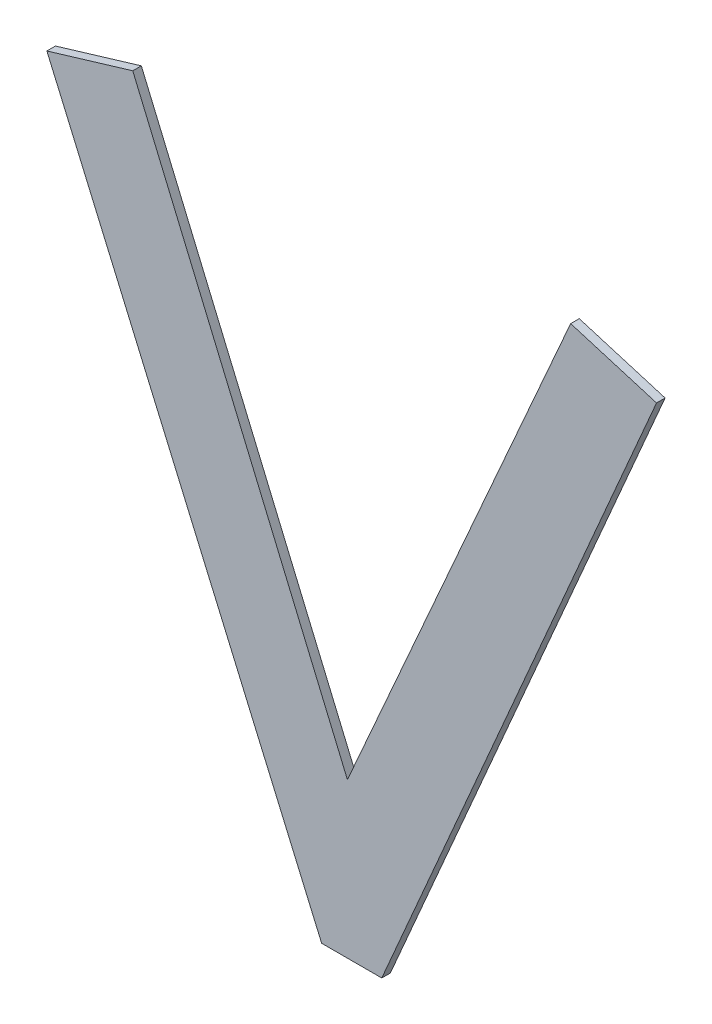
ISO-10303-21;
HEADER;
FILE_DESCRIPTION(('STEP AP214'),'2;1');
FILE_NAME('part.step','',(''),(''),'','','');
FILE_SCHEMA(('AUTOMOTIVE_DESIGN { 1 0 10303 214 1 1 1 1 }'));
ENDSEC;
DATA;
#1=APPLICATION_CONTEXT('core data for automotive mechanical design processes');
#2=APPLICATION_PROTOCOL_DEFINITION('international standard','automotive_design',2000,#1);
#3=PRODUCT_CONTEXT('',#1,'mechanical');
#4=PRODUCT('Part','Part','',(#3));
#5=PRODUCT_RELATED_PRODUCT_CATEGORY('part','',(#4));
#6=PRODUCT_DEFINITION_FORMATION('','',#4);
#7=PRODUCT_DEFINITION_CONTEXT('part definition',#1,'design');
#8=PRODUCT_DEFINITION('design','',#6,#7);
#9=PRODUCT_DEFINITION_SHAPE('','',#8);
#10=(LENGTH_UNIT() NAMED_UNIT(*) SI_UNIT(.MILLI.,.METRE.));
#11=(NAMED_UNIT(*) PLANE_ANGLE_UNIT() SI_UNIT($,.RADIAN.));
#12=(NAMED_UNIT(*) SI_UNIT($,.STERADIAN.) SOLID_ANGLE_UNIT());
#13=UNCERTAINTY_MEASURE_WITH_UNIT(LENGTH_MEASURE(1.E-05),#10,'distance_accuracy_value','');
#14=(GEOMETRIC_REPRESENTATION_CONTEXT(3) GLOBAL_UNCERTAINTY_ASSIGNED_CONTEXT((#13)) GLOBAL_UNIT_ASSIGNED_CONTEXT((#10,
#11,#12)) REPRESENTATION_CONTEXT('',''));
#15=CARTESIAN_POINT('',(0.,0.,0.));
#16=DIRECTION('',(0.,0.,1.));
#17=DIRECTION('',(1.,0.,0.));
#18=AXIS2_PLACEMENT_3D('',#15,#16,#17);
#19=CARTESIAN_POINT('',(-0.35500056,0.35500056,0.01));
#20=DIRECTION('',(0.,0.,-1.));
#21=DIRECTION('',(-1.,0.,0.));
#22=AXIS2_PLACEMENT_3D('',#19,#20,#21);
#23=PLANE('',#22);
#24=DIRECTION('',(1.,0.,0.));
#25=VECTOR('',#24,1.);
#26=CARTESIAN_POINT('',(-0.03500120000001,-0.3850005,0.01));
#27=LINE('',#26,#25);
#28=CARTESIAN_POINT('',(-0.0350012000000438,-0.385000500000015,0.01));
#29=VERTEX_POINT('',#28);
#30=CARTESIAN_POINT('',(0.03499865999999,-0.3850005,0.01));
#31=VERTEX_POINT('',#30);
#32=EDGE_CURVE('E106',#29,#31,#27,.T.);
#33=ORIENTED_EDGE('',*,*,#32,.T.);
#34=DIRECTION('',(-0.396912657096808,-0.917856384537555,0.));
#35=VECTOR('',#34,1.);
#36=CARTESIAN_POINT('',(0.03499865999999,-0.3850005,0.01));
#37=LINE('',#36,#35);
#38=CARTESIAN_POINT('',(0.355000559999976,0.35500056000001,0.01));
#39=VERTEX_POINT('',#38);
#40=EDGE_CURVE('E102',#31,#39,#37,.F.);
#41=ORIENTED_EDGE('',*,*,#40,.T.);
#42=DIRECTION('',(0.957828293954041,-0.287341189705012,0.));
#43=VECTOR('',#42,1.);
#44=CARTESIAN_POINT('',(0.35500056,0.35500056,0.01));
#45=LINE('',#44,#43);
#46=CARTESIAN_POINT('',(0.254998219999997,0.385000499999991,0.01));
#47=VERTEX_POINT('',#46);
#48=EDGE_CURVE('E98',#39,#47,#45,.F.);
#49=ORIENTED_EDGE('',*,*,#48,.T.);
#50=DIRECTION('',(0.403256865537213,0.915086826698484,0.));
#51=VECTOR('',#50,1.);
#52=CARTESIAN_POINT('',(0.25499822,0.3850005,0.01));
#53=LINE('',#52,#51);
#54=CARTESIAN_POINT('',(-0.00500125999996274,-0.205000860000016,0.01));
#55=VERTEX_POINT('',#54);
#56=EDGE_CURVE('E74',#47,#55,#53,.F.);
#57=ORIENTED_EDGE('',*,*,#56,.T.);
#58=DIRECTION('',(0.390147610227827,-0.920752324044591,0.));
#59=VECTOR('',#58,1.);
#60=CARTESIAN_POINT('',(-0.00500126,-0.20500086,0.01));
#61=LINE('',#60,#59);
#62=CARTESIAN_POINT('',(-0.255000760000042,0.385000499999982,0.01));
#63=VERTEX_POINT('',#62);
#64=EDGE_CURVE('E76',#55,#63,#61,.F.);
#65=ORIENTED_EDGE('',*,*,#64,.T.);
#66=DIRECTION('',(0.957826285221234,0.28734788556607,0.));
#67=VECTOR('',#66,1.);
#68=CARTESIAN_POINT('',(-0.25500076,0.3850005,0.01));
#69=LINE('',#68,#67);
#70=CARTESIAN_POINT('',(-0.355000560000004,0.355000560000014,0.01));
#71=VERTEX_POINT('',#70);
#72=EDGE_CURVE('E20',#63,#71,#69,.F.);
#73=ORIENTED_EDGE('',*,*,#72,.T.);
#74=DIRECTION('',(-0.396910002941081,0.917857532281187,0.));
#75=VECTOR('',#74,1.);
#76=CARTESIAN_POINT('',(-0.35500056,0.35500056,0.01));
#77=LINE('',#76,#75);
#78=EDGE_CURVE('E111',#71,#29,#77,.F.);
#79=ORIENTED_EDGE('',*,*,#78,.T.);
#80=EDGE_LOOP('',(#33,#41,#49,#57,#65,#73,#79));
#81=FACE_BOUND('',#80,.T.);
#82=ADVANCED_FACE('F17',(#81),#23,.F.);
#83=CARTESIAN_POINT('',(-0.25500076,0.3850005,0.));
#84=DIRECTION('',(0.28734788556607,-0.957826285221234,0.));
#85=DIRECTION('',(0.957826285221234,0.28734788556607,0.));
#86=AXIS2_PLACEMENT_3D('',#83,#84,#85);
#87=PLANE('',#86);
#88=DIRECTION('',(0.,0.,1.));
#89=VECTOR('',#88,1.);
#90=CARTESIAN_POINT('',(-0.35500056,0.35500056,0.));
#91=LINE('',#90,#89);
#92=CARTESIAN_POINT('',(-0.355000560000004,0.355000560000014,0.));
#93=VERTEX_POINT('',#92);
#94=EDGE_CURVE('E87',#93,#71,#91,.T.);
#95=ORIENTED_EDGE('',*,*,#94,.T.);
#96=ORIENTED_EDGE('',*,*,#72,.F.);
#97=DIRECTION('',(0.,0.,1.));
#98=VECTOR('',#97,1.);
#99=CARTESIAN_POINT('',(-0.255000760000168,0.385000499999929,0.));
#100=LINE('',#99,#98);
#101=CARTESIAN_POINT('',(-0.255000760000042,0.385000499999982,0.));
#102=VERTEX_POINT('',#101);
#103=EDGE_CURVE('E82',#63,#102,#100,.F.);
#104=ORIENTED_EDGE('',*,*,#103,.T.);
#105=DIRECTION('',(0.957826285221151,0.287347885566345,0.));
#106=VECTOR('',#105,1.);
#107=CARTESIAN_POINT('',(-0.35500056,0.35500056,0.));
#108=LINE('',#107,#106);
#109=EDGE_CURVE('E114',#93,#102,#108,.T.);
#110=ORIENTED_EDGE('',*,*,#109,.F.);
#111=EDGE_LOOP('',(#95,#96,#104,#110));
#112=FACE_BOUND('',#111,.T.);
#113=ADVANCED_FACE('F84',(#112),#87,.F.);
#114=CARTESIAN_POINT('',(-0.00500126,-0.20500086,0.));
#115=DIRECTION('',(-0.920752324044591,-0.390147610227827,0.));
#116=DIRECTION('',(0.390147610227827,-0.920752324044591,0.));
#117=AXIS2_PLACEMENT_3D('',#114,#115,#116);
#118=PLANE('',#117);
#119=ORIENTED_EDGE('',*,*,#103,.F.);
#120=ORIENTED_EDGE('',*,*,#64,.F.);
#121=DIRECTION('',(0.,0.,1.));
#122=VECTOR('',#121,1.);
#123=CARTESIAN_POINT('',(-0.00500125999985089,-0.205000860000066,0.));
#124=LINE('',#123,#122);
#125=CARTESIAN_POINT('',(-0.00500125999996274,-0.205000860000016,0.));
#126=VERTEX_POINT('',#125);
#127=EDGE_CURVE('E94',#55,#126,#124,.F.);
#128=ORIENTED_EDGE('',*,*,#127,.T.);
#129=DIRECTION('',(0.390147610227565,-0.920752324044702,0.));
#130=VECTOR('',#129,1.);
#131=CARTESIAN_POINT('',(-0.25500076,0.3850005,0.));
#132=LINE('',#131,#130);
#133=EDGE_CURVE('E91',#102,#126,#132,.T.);
#134=ORIENTED_EDGE('',*,*,#133,.F.);
#135=EDGE_LOOP('',(#119,#120,#128,#134));
#136=FACE_BOUND('',#135,.T.);
#137=ADVANCED_FACE('F89',(#136),#118,.F.);
#138=CARTESIAN_POINT('',(0.25499822,0.3850005,0.));
#139=DIRECTION('',(0.915086826698484,-0.403256865537213,0.));
#140=DIRECTION('',(0.403256865537213,0.915086826698484,0.));
#141=AXIS2_PLACEMENT_3D('',#138,#139,#140);
#142=PLANE('',#141);
#143=ORIENTED_EDGE('',*,*,#127,.F.);
#144=ORIENTED_EDGE('',*,*,#56,.F.);
#145=DIRECTION('',(0.,0.,1.));
#146=VECTOR('',#145,1.);
#147=CARTESIAN_POINT('',(0.254998219999989,0.385000499999963,0.));
#148=LINE('',#147,#146);
#149=CARTESIAN_POINT('',(0.254998219999997,0.385000499999991,0.));
#150=VERTEX_POINT('',#149);
#151=EDGE_CURVE('E100',#47,#150,#148,.F.);
#152=ORIENTED_EDGE('',*,*,#151,.T.);
#153=DIRECTION('',(0.403256865537445,0.915086826698382,0.));
#154=VECTOR('',#153,1.);
#155=CARTESIAN_POINT('',(-0.00500126000000002,-0.20500086,0.));
#156=LINE('',#155,#154);
#157=EDGE_CURVE('E117',#126,#150,#156,.T.);
#158=ORIENTED_EDGE('',*,*,#157,.F.);
#159=EDGE_LOOP('',(#143,#144,#152,#158));
#160=FACE_BOUND('',#159,.T.);
#161=ADVANCED_FACE('F143',(#160),#142,.F.);
#162=CARTESIAN_POINT('',(0.35500056,0.35500056,0.));
#163=DIRECTION('',(-0.287341189705012,-0.957828293954041,0.));
#164=DIRECTION('',(0.957828293954041,-0.287341189705012,0.));
#165=AXIS2_PLACEMENT_3D('',#162,#163,#164);
#166=PLANE('',#165);
#167=ORIENTED_EDGE('',*,*,#151,.F.);
#168=ORIENTED_EDGE('',*,*,#48,.F.);
#169=DIRECTION('',(0.,0.,1.));
#170=VECTOR('',#169,1.);
#171=CARTESIAN_POINT('',(0.355000559999905,0.355000560000041,0.));
#172=LINE('',#171,#170);
#173=CARTESIAN_POINT('',(0.355000559999976,0.35500056000001,0.));
#174=VERTEX_POINT('',#173);
#175=EDGE_CURVE('E104',#39,#174,#172,.F.);
#176=ORIENTED_EDGE('',*,*,#175,.T.);
#177=DIRECTION('',(0.957828293953935,-0.287341189705365,0.));
#178=VECTOR('',#177,1.);
#179=CARTESIAN_POINT('',(0.25499822,0.3850005,0.));
#180=LINE('',#179,#178);
#181=EDGE_CURVE('E120',#150,#174,#180,.T.);
#182=ORIENTED_EDGE('',*,*,#181,.F.);
#183=EDGE_LOOP('',(#167,#168,#176,#182));
#184=FACE_BOUND('',#183,.T.);
#185=ADVANCED_FACE('F139',(#184),#166,.F.);
#186=CARTESIAN_POINT('',(0.03499865999999,-0.3850005,0.));
#187=DIRECTION('',(-0.917856384537555,0.396912657096808,0.));
#188=DIRECTION('',(-0.396912657096808,-0.917856384537555,0.));
#189=AXIS2_PLACEMENT_3D('',#186,#187,#188);
#190=PLANE('',#189);
#191=ORIENTED_EDGE('',*,*,#175,.F.);
#192=ORIENTED_EDGE('',*,*,#40,.F.);
#193=DIRECTION('',(0.,0.,1.));
#194=VECTOR('',#193,1.);
#195=CARTESIAN_POINT('',(0.03499865999999,-0.3850005,0.));
#196=LINE('',#195,#194);
#197=CARTESIAN_POINT('',(0.03499865999999,-0.3850005,0.));
#198=VERTEX_POINT('',#197);
#199=EDGE_CURVE('E108',#31,#198,#196,.F.);
#200=ORIENTED_EDGE('',*,*,#199,.T.);
#201=DIRECTION('',(-0.396912657096925,-0.917856384537504,0.));
#202=VECTOR('',#201,1.);
#203=CARTESIAN_POINT('',(0.35500056,0.35500056,0.));
#204=LINE('',#203,#202);
#205=EDGE_CURVE('E123',#174,#198,#204,.T.);
#206=ORIENTED_EDGE('',*,*,#205,.F.);
#207=EDGE_LOOP('',(#191,#192,#200,#206));
#208=FACE_BOUND('',#207,.T.);
#209=ADVANCED_FACE('F135',(#208),#190,.F.);
#210=CARTESIAN_POINT('',(-0.03500120000001,-0.3850005,0.));
#211=DIRECTION('',(0.,1.,0.));
#212=DIRECTION('',(0.,0.,1.));
#213=AXIS2_PLACEMENT_3D('',#210,#211,#212);
#214=PLANE('',#213);
#215=ORIENTED_EDGE('',*,*,#199,.F.);
#216=ORIENTED_EDGE('',*,*,#32,.F.);
#217=DIRECTION('',(0.,0.,1.));
#218=VECTOR('',#217,1.);
#219=CARTESIAN_POINT('',(-0.035001200000145,-0.385000500000058,0.));
#220=LINE('',#219,#218);
#221=CARTESIAN_POINT('',(-0.0350012000000438,-0.385000500000015,0.));
#222=VERTEX_POINT('',#221);
#223=EDGE_CURVE('E35',#29,#222,#220,.F.);
#224=ORIENTED_EDGE('',*,*,#223,.T.);
#225=DIRECTION('',(-1.,0.,0.));
#226=VECTOR('',#225,1.);
#227=CARTESIAN_POINT('',(-0.35500056,-0.3850005,0.));
#228=LINE('',#227,#226);
#229=EDGE_CURVE('E26',#198,#222,#228,.T.);
#230=ORIENTED_EDGE('',*,*,#229,.F.);
#231=EDGE_LOOP('',(#215,#216,#224,#230));
#232=FACE_BOUND('',#231,.T.);
#233=ADVANCED_FACE('F131',(#232),#214,.F.);
#234=CARTESIAN_POINT('',(-0.35500056,0.35500056,0.));
#235=DIRECTION('',(0.917857532281187,0.396910002941081,0.));
#236=DIRECTION('',(-0.396910002941081,0.917857532281187,0.));
#237=AXIS2_PLACEMENT_3D('',#234,#235,#236);
#238=PLANE('',#237);
#239=ORIENTED_EDGE('',*,*,#223,.F.);
#240=ORIENTED_EDGE('',*,*,#78,.F.);
#241=ORIENTED_EDGE('',*,*,#94,.F.);
#242=DIRECTION('',(-0.396910002941249,0.917857532281115,0.));
#243=VECTOR('',#242,1.);
#244=CARTESIAN_POINT('',(-0.03500120000001,-0.3850005,0.));
#245=LINE('',#244,#243);
#246=EDGE_CURVE('E11',#222,#93,#245,.T.);
#247=ORIENTED_EDGE('',*,*,#246,.F.);
#248=EDGE_LOOP('',(#239,#240,#241,#247));
#249=FACE_BOUND('',#248,.T.);
#250=ADVANCED_FACE('F145',(#249),#238,.F.);
#251=CARTESIAN_POINT('',(-0.35500056,0.35500056,0.));
#252=DIRECTION('',(0.,0.,-1.));
#253=DIRECTION('',(-1.,0.,0.));
#254=AXIS2_PLACEMENT_3D('',#251,#252,#253);
#255=PLANE('',#254);
#256=ORIENTED_EDGE('',*,*,#229,.T.);
#257=ORIENTED_EDGE('',*,*,#246,.T.);
#258=ORIENTED_EDGE('',*,*,#109,.T.);
#259=ORIENTED_EDGE('',*,*,#133,.T.);
#260=ORIENTED_EDGE('',*,*,#157,.T.);
#261=ORIENTED_EDGE('',*,*,#181,.T.);
#262=ORIENTED_EDGE('',*,*,#205,.T.);
#263=EDGE_LOOP('',(#256,#257,#258,#259,#260,#261,#262));
#264=FACE_BOUND('',#263,.T.);
#265=ADVANCED_FACE('F128',(#264),#255,.T.);
#266=CLOSED_SHELL('',(#82,#113,#137,#161,#185,#209,#233,#250,#265));
#267=MANIFOLD_SOLID_BREP('B1',#266);
#268=ADVANCED_BREP_SHAPE_REPRESENTATION('',(#18,#267),#14);
#269=SHAPE_DEFINITION_REPRESENTATION(#9,#268);
ENDSEC;
END-ISO-10303-21;
